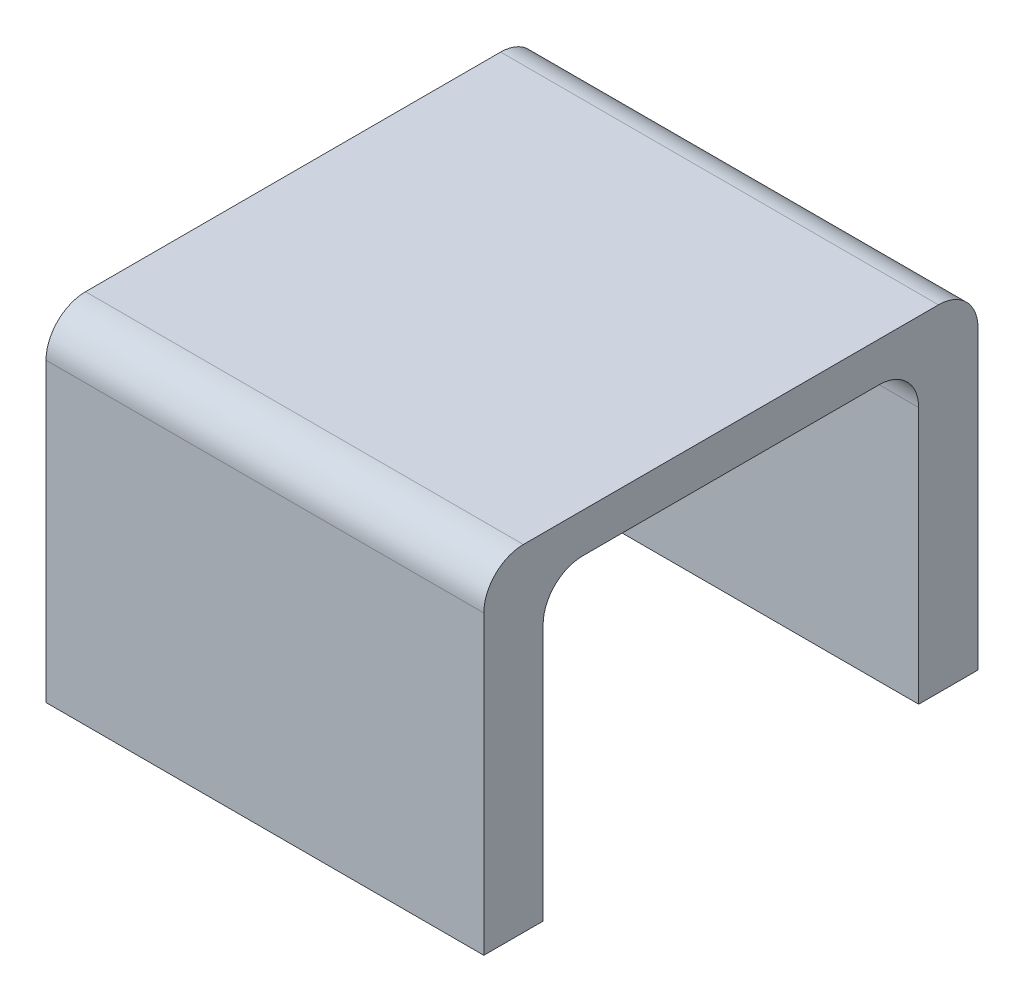
ISO-10303-21;
HEADER;
FILE_DESCRIPTION(('STEP AP214'),'2;1');
FILE_NAME('part.step','',(''),(''),'','','');
FILE_SCHEMA(('AUTOMOTIVE_DESIGN { 1 0 10303 214 1 1 1 1 }'));
ENDSEC;
DATA;
#1=APPLICATION_CONTEXT('core data for automotive mechanical design processes');
#2=APPLICATION_PROTOCOL_DEFINITION('international standard','automotive_design',2000,#1);
#3=PRODUCT_CONTEXT('',#1,'mechanical');
#4=PRODUCT('Part','Part','',(#3));
#5=PRODUCT_RELATED_PRODUCT_CATEGORY('part','',(#4));
#6=PRODUCT_DEFINITION_FORMATION('','',#4);
#7=PRODUCT_DEFINITION_CONTEXT('part definition',#1,'design');
#8=PRODUCT_DEFINITION('design','',#6,#7);
#9=PRODUCT_DEFINITION_SHAPE('','',#8);
#10=(LENGTH_UNIT() NAMED_UNIT(*) SI_UNIT(.MILLI.,.METRE.));
#11=(NAMED_UNIT(*) PLANE_ANGLE_UNIT() SI_UNIT($,.RADIAN.));
#12=(NAMED_UNIT(*) SI_UNIT($,.STERADIAN.) SOLID_ANGLE_UNIT());
#13=UNCERTAINTY_MEASURE_WITH_UNIT(LENGTH_MEASURE(1.E-05),#10,'distance_accuracy_value','');
#14=(GEOMETRIC_REPRESENTATION_CONTEXT(3) GLOBAL_UNCERTAINTY_ASSIGNED_CONTEXT((#13)) GLOBAL_UNIT_ASSIGNED_CONTEXT((#10,
#11,#12)) REPRESENTATION_CONTEXT('',''));
#15=CARTESIAN_POINT('',(0.,0.,0.));
#16=DIRECTION('',(0.,0.,1.));
#17=DIRECTION('',(1.,0.,0.));
#18=AXIS2_PLACEMENT_3D('',#15,#16,#17);
#19=CARTESIAN_POINT('',(0.,0.,0.));
#20=DIRECTION('',(0.,1.,0.));
#21=DIRECTION('',(0.,0.,1.));
#22=AXIS2_PLACEMENT_3D('',#19,#20,#21);
#23=PLANE('',#22);
#24=DIRECTION('',(0.,0.,1.));
#25=VECTOR('',#24,1.);
#26=CARTESIAN_POINT('',(6.16632653061225,0.,-12.8401360544218));
#27=LINE('',#26,#25);
#28=CARTESIAN_POINT('',(6.16632653061225,0.,9.15986394557823));
#29=VERTEX_POINT('',#28);
#30=CARTESIAN_POINT('',(6.16632653061225,0.,12.1598639455782));
#31=VERTEX_POINT('',#30);
#32=EDGE_CURVE('E214',#29,#31,#27,.T.);
#33=ORIENTED_EDGE('',*,*,#32,.F.);
#34=DIRECTION('',(-1.,0.,0.));
#35=VECTOR('',#34,1.);
#36=CARTESIAN_POINT('',(6.16632653061225,0.,9.15986394557823));
#37=LINE('',#36,#35);
#38=CARTESIAN_POINT('',(28.3163265306122,0.,9.15986394557823));
#39=VERTEX_POINT('',#38);
#40=EDGE_CURVE('E147',#39,#29,#37,.T.);
#41=ORIENTED_EDGE('',*,*,#40,.F.);
#42=DIRECTION('',(0.,0.,-1.));
#43=VECTOR('',#42,1.);
#44=CARTESIAN_POINT('',(28.3163265306122,0.,-12.8401360544218));
#45=LINE('',#44,#43);
#46=CARTESIAN_POINT('',(28.3163265306122,0.,12.1598639455782));
#47=VERTEX_POINT('',#46);
#48=EDGE_CURVE('E152',#47,#39,#45,.T.);
#49=ORIENTED_EDGE('',*,*,#48,.F.);
#50=DIRECTION('',(1.,0.,0.));
#51=VECTOR('',#50,1.);
#52=CARTESIAN_POINT('',(6.16632653061225,0.,12.1598639455782));
#53=LINE('',#52,#51);
#54=EDGE_CURVE('E153',#31,#47,#53,.T.);
#55=ORIENTED_EDGE('',*,*,#54,.F.);
#56=EDGE_LOOP('',(#33,#41,#49,#55));
#57=FACE_BOUND('',#56,.T.);
#58=ADVANCED_FACE('F39',(#57),#23,.F.);
#59=CARTESIAN_POINT('',(6.16632653061225,17.,-12.8401360544218));
#60=DIRECTION('',(1.,0.,0.));
#61=DIRECTION('',(0.,0.,-1.));
#62=AXIS2_PLACEMENT_3D('',#59,#60,#61);
#63=PLANE('',#62);
#64=DIRECTION('',(0.,0.,1.));
#65=VECTOR('',#64,1.);
#66=CARTESIAN_POINT('',(6.16632653061225,17.,-12.8401360544218));
#67=LINE('',#66,#65);
#68=CARTESIAN_POINT('',(6.16632653061225,17.,-10.8401360544218));
#69=VERTEX_POINT('',#68);
#70=CARTESIAN_POINT('',(6.16632653061225,17.,10.1598639455782));
#71=VERTEX_POINT('',#70);
#72=EDGE_CURVE('E162',#69,#71,#67,.T.);
#73=ORIENTED_EDGE('',*,*,#72,.F.);
#74=CARTESIAN_POINT('',(6.16632653061225,15.,-10.8401360544218));
#75=DIRECTION('',(1.,0.,0.));
#76=DIRECTION('',(0.,0.,-1.));
#77=AXIS2_PLACEMENT_3D('',#74,#75,#76);
#78=CIRCLE('',#77,2.);
#79=CARTESIAN_POINT('',(6.16632653061225,15.,-12.8401360544218));
#80=VERTEX_POINT('',#79);
#81=EDGE_CURVE('E197',#69,#80,#78,.F.);
#82=ORIENTED_EDGE('',*,*,#81,.T.);
#83=DIRECTION('',(0.,-1.,0.));
#84=VECTOR('',#83,1.);
#85=CARTESIAN_POINT('',(6.16632653061225,17.,-12.8401360544218));
#86=LINE('',#85,#84);
#87=CARTESIAN_POINT('',(6.16632653061225,0.,-12.8401360544218));
#88=VERTEX_POINT('',#87);
#89=EDGE_CURVE('E163',#80,#88,#86,.T.);
#90=ORIENTED_EDGE('',*,*,#89,.T.);
#91=CARTESIAN_POINT('',(6.16632653061225,0.,-9.84013605442176));
#92=VERTEX_POINT('',#91);
#93=EDGE_CURVE('E157',#88,#92,#27,.T.);
#94=ORIENTED_EDGE('',*,*,#93,.T.);
#95=DIRECTION('',(0.,-1.,0.));
#96=VECTOR('',#95,1.);
#97=CARTESIAN_POINT('',(6.16632653061225,15.,-9.84013605442176));
#98=LINE('',#97,#96);
#99=CARTESIAN_POINT('',(6.16632653061225,13.,-9.84013605442176));
#100=VERTEX_POINT('',#99);
#101=EDGE_CURVE('E138',#100,#92,#98,.T.);
#102=ORIENTED_EDGE('',*,*,#101,.F.);
#103=CARTESIAN_POINT('',(6.16632653061225,13.,-7.84013605442176));
#104=DIRECTION('',(1.,0.,0.));
#105=DIRECTION('',(0.,0.,-1.));
#106=AXIS2_PLACEMENT_3D('',#103,#104,#105);
#107=CIRCLE('',#106,2.);
#108=CARTESIAN_POINT('',(6.16632653061225,15.,-7.84013605442176));
#109=VERTEX_POINT('',#108);
#110=EDGE_CURVE('E183',#100,#109,#107,.T.);
#111=ORIENTED_EDGE('',*,*,#110,.T.);
#112=DIRECTION('',(0.,0.,-1.));
#113=VECTOR('',#112,1.);
#114=CARTESIAN_POINT('',(6.16632653061225,15.,9.15986394557823));
#115=LINE('',#114,#113);
#116=CARTESIAN_POINT('',(6.16632653061225,15.,7.15986394557823));
#117=VERTEX_POINT('',#116);
#118=EDGE_CURVE('E224',#117,#109,#115,.T.);
#119=ORIENTED_EDGE('',*,*,#118,.F.);
#120=CARTESIAN_POINT('',(6.16632653061225,13.,7.15986394557823));
#121=DIRECTION('',(1.,0.,0.));
#122=DIRECTION('',(0.,0.,-1.));
#123=AXIS2_PLACEMENT_3D('',#120,#121,#122);
#124=CIRCLE('',#123,2.);
#125=CARTESIAN_POINT('',(6.16632653061225,13.,9.15986394557823));
#126=VERTEX_POINT('',#125);
#127=EDGE_CURVE('E185',#117,#126,#124,.T.);
#128=ORIENTED_EDGE('',*,*,#127,.T.);
#129=DIRECTION('',(0.,-1.,0.));
#130=VECTOR('',#129,1.);
#131=CARTESIAN_POINT('',(6.16632653061225,15.,9.15986394557823));
#132=LINE('',#131,#130);
#133=EDGE_CURVE('E216',#126,#29,#132,.T.);
#134=ORIENTED_EDGE('',*,*,#133,.T.);
#135=ORIENTED_EDGE('',*,*,#32,.T.);
#136=DIRECTION('',(0.,-1.,0.));
#137=VECTOR('',#136,1.);
#138=CARTESIAN_POINT('',(6.16632653061225,17.,12.1598639455782));
#139=LINE('',#138,#137);
#140=CARTESIAN_POINT('',(6.16632653061225,15.,12.1598639455782));
#141=VERTEX_POINT('',#140);
#142=EDGE_CURVE('E170',#141,#31,#139,.T.);
#143=ORIENTED_EDGE('',*,*,#142,.F.);
#144=CARTESIAN_POINT('',(6.16632653061225,15.,10.1598639455782));
#145=DIRECTION('',(1.,0.,0.));
#146=DIRECTION('',(0.,0.,-1.));
#147=AXIS2_PLACEMENT_3D('',#144,#145,#146);
#148=CIRCLE('',#147,2.);
#149=EDGE_CURVE('E195',#141,#71,#148,.F.);
#150=ORIENTED_EDGE('',*,*,#149,.T.);
#151=EDGE_LOOP('',(#73,#82,#90,#94,#102,#111,#119,#128,#134,#135,#143,#150));
#152=FACE_BOUND('',#151,.T.);
#153=ADVANCED_FACE('F212',(#152),#63,.F.);
#154=CARTESIAN_POINT('',(6.16632653061225,17.,12.1598639455782));
#155=DIRECTION('',(0.,0.,-1.));
#156=DIRECTION('',(-1.,0.,0.));
#157=AXIS2_PLACEMENT_3D('',#154,#155,#156);
#158=PLANE('',#157);
#159=DIRECTION('',(0.,-1.,0.));
#160=VECTOR('',#159,1.);
#161=CARTESIAN_POINT('',(28.3163265306122,17.,12.1598639455782));
#162=LINE('',#161,#160);
#163=CARTESIAN_POINT('',(28.3163265306122,15.,12.1598639455782));
#164=VERTEX_POINT('',#163);
#165=EDGE_CURVE('E168',#164,#47,#162,.T.);
#166=ORIENTED_EDGE('',*,*,#165,.F.);
#167=DIRECTION('',(1.,0.,0.));
#168=VECTOR('',#167,1.);
#169=CARTESIAN_POINT('',(6.16632653061225,15.,12.1598639455782));
#170=LINE('',#169,#168);
#171=EDGE_CURVE('E11',#164,#141,#170,.F.);
#172=ORIENTED_EDGE('',*,*,#171,.T.);
#173=ORIENTED_EDGE('',*,*,#142,.T.);
#174=ORIENTED_EDGE('',*,*,#54,.T.);
#175=EDGE_LOOP('',(#166,#172,#173,#174));
#176=FACE_BOUND('',#175,.T.);
#177=ADVANCED_FACE('F255',(#176),#158,.F.);
#178=CARTESIAN_POINT('',(28.3163265306122,17.,-12.8401360544218));
#179=DIRECTION('',(-1.,0.,0.));
#180=DIRECTION('',(0.,0.,1.));
#181=AXIS2_PLACEMENT_3D('',#178,#179,#180);
#182=PLANE('',#181);
#183=DIRECTION('',(0.,-1.,0.));
#184=VECTOR('',#183,1.);
#185=CARTESIAN_POINT('',(28.3163265306122,17.,-12.8401360544218));
#186=LINE('',#185,#184);
#187=CARTESIAN_POINT('',(28.3163265306122,15.,-12.8401360544218));
#188=VERTEX_POINT('',#187);
#189=CARTESIAN_POINT('',(28.3163265306122,0.,-12.8401360544218));
#190=VERTEX_POINT('',#189);
#191=EDGE_CURVE('E165',#188,#190,#186,.T.);
#192=ORIENTED_EDGE('',*,*,#191,.F.);
#193=CARTESIAN_POINT('',(28.3163265306122,15.,-10.8401360544218));
#194=DIRECTION('',(-1.,0.,0.));
#195=DIRECTION('',(0.,0.,1.));
#196=AXIS2_PLACEMENT_3D('',#193,#194,#195);
#197=CIRCLE('',#196,2.);
#198=CARTESIAN_POINT('',(28.3163265306122,17.,-10.8401360544218));
#199=VERTEX_POINT('',#198);
#200=EDGE_CURVE('E47',#188,#199,#197,.F.);
#201=ORIENTED_EDGE('',*,*,#200,.T.);
#202=DIRECTION('',(0.,0.,-1.));
#203=VECTOR('',#202,1.);
#204=CARTESIAN_POINT('',(28.3163265306122,17.,-12.8401360544218));
#205=LINE('',#204,#203);
#206=CARTESIAN_POINT('',(28.3163265306122,17.,10.1598639455782));
#207=VERTEX_POINT('',#206);
#208=EDGE_CURVE('E166',#207,#199,#205,.T.);
#209=ORIENTED_EDGE('',*,*,#208,.F.);
#210=CARTESIAN_POINT('',(28.3163265306122,15.,10.1598639455782));
#211=DIRECTION('',(-1.,0.,0.));
#212=DIRECTION('',(0.,0.,1.));
#213=AXIS2_PLACEMENT_3D('',#210,#211,#212);
#214=CIRCLE('',#213,2.);
#215=EDGE_CURVE('E54',#207,#164,#214,.F.);
#216=ORIENTED_EDGE('',*,*,#215,.T.);
#217=ORIENTED_EDGE('',*,*,#165,.T.);
#218=ORIENTED_EDGE('',*,*,#48,.T.);
#219=DIRECTION('',(0.,-1.,0.));
#220=VECTOR('',#219,1.);
#221=CARTESIAN_POINT('',(28.3163265306122,15.,9.15986394557823));
#222=LINE('',#221,#220);
#223=CARTESIAN_POINT('',(28.3163265306122,13.,9.15986394557823));
#224=VERTEX_POINT('',#223);
#225=EDGE_CURVE('E137',#224,#39,#222,.T.);
#226=ORIENTED_EDGE('',*,*,#225,.F.);
#227=CARTESIAN_POINT('',(28.3163265306122,13.,7.15986394557823));
#228=DIRECTION('',(-1.,0.,0.));
#229=DIRECTION('',(0.,0.,1.));
#230=AXIS2_PLACEMENT_3D('',#227,#228,#229);
#231=CIRCLE('',#230,2.);
#232=CARTESIAN_POINT('',(28.3163265306122,15.,7.15986394557823));
#233=VERTEX_POINT('',#232);
#234=EDGE_CURVE('E187',#224,#233,#231,.T.);
#235=ORIENTED_EDGE('',*,*,#234,.T.);
#236=DIRECTION('',(0.,0.,1.));
#237=VECTOR('',#236,1.);
#238=CARTESIAN_POINT('',(28.3163265306122,15.,9.15986394557823));
#239=LINE('',#238,#237);
#240=CARTESIAN_POINT('',(28.3163265306122,15.,-7.84013605442177));
#241=VERTEX_POINT('',#240);
#242=EDGE_CURVE('E219',#241,#233,#239,.T.);
#243=ORIENTED_EDGE('',*,*,#242,.F.);
#244=CARTESIAN_POINT('',(28.3163265306122,13.,-7.84013605442177));
#245=DIRECTION('',(-1.,0.,0.));
#246=DIRECTION('',(0.,0.,1.));
#247=AXIS2_PLACEMENT_3D('',#244,#245,#246);
#248=CIRCLE('',#247,2.);
#249=CARTESIAN_POINT('',(28.3163265306122,13.,-9.84013605442176));
#250=VERTEX_POINT('',#249);
#251=EDGE_CURVE('E134',#241,#250,#248,.T.);
#252=ORIENTED_EDGE('',*,*,#251,.T.);
#253=DIRECTION('',(0.,-1.,0.));
#254=VECTOR('',#253,1.);
#255=CARTESIAN_POINT('',(28.3163265306122,15.,-9.84013605442176));
#256=LINE('',#255,#254);
#257=CARTESIAN_POINT('',(28.3163265306122,0.,-9.84013605442176));
#258=VERTEX_POINT('',#257);
#259=EDGE_CURVE('E127',#250,#258,#256,.T.);
#260=ORIENTED_EDGE('',*,*,#259,.T.);
#261=EDGE_CURVE('E131',#258,#190,#45,.T.);
#262=ORIENTED_EDGE('',*,*,#261,.T.);
#263=EDGE_LOOP('',(#192,#201,#209,#216,#217,#218,#226,#235,#243,#252,#260,#262));
#264=FACE_BOUND('',#263,.T.);
#265=ADVANCED_FACE('F129',(#264),#182,.F.);
#266=CARTESIAN_POINT('',(6.16632653061225,17.,-12.8401360544218));
#267=DIRECTION('',(0.,0.,1.));
#268=DIRECTION('',(1.,0.,0.));
#269=AXIS2_PLACEMENT_3D('',#266,#267,#268);
#270=PLANE('',#269);
#271=ORIENTED_EDGE('',*,*,#89,.F.);
#272=DIRECTION('',(-1.,0.,0.));
#273=VECTOR('',#272,1.);
#274=CARTESIAN_POINT('',(28.3163265306122,15.,-12.8401360544218));
#275=LINE('',#274,#273);
#276=EDGE_CURVE('E62',#80,#188,#275,.F.);
#277=ORIENTED_EDGE('',*,*,#276,.T.);
#278=ORIENTED_EDGE('',*,*,#191,.T.);
#279=DIRECTION('',(-1.,0.,0.));
#280=VECTOR('',#279,1.);
#281=CARTESIAN_POINT('',(6.16632653061225,0.,-12.8401360544218));
#282=LINE('',#281,#280);
#283=EDGE_CURVE('E151',#190,#88,#282,.T.);
#284=ORIENTED_EDGE('',*,*,#283,.T.);
#285=EDGE_LOOP('',(#271,#277,#278,#284));
#286=FACE_BOUND('',#285,.T.);
#287=ADVANCED_FACE('F213',(#286),#270,.F.);
#288=CARTESIAN_POINT('',(0.,17.,0.));
#289=DIRECTION('',(0.,1.,0.));
#290=DIRECTION('',(0.,0.,1.));
#291=AXIS2_PLACEMENT_3D('',#288,#289,#290);
#292=PLANE('',#291);
#293=ORIENTED_EDGE('',*,*,#208,.T.);
#294=DIRECTION('',(-1.,0.,0.));
#295=VECTOR('',#294,1.);
#296=CARTESIAN_POINT('',(6.16632653061225,17.,-10.8401360544218));
#297=LINE('',#296,#295);
#298=EDGE_CURVE('E192',#199,#69,#297,.T.);
#299=ORIENTED_EDGE('',*,*,#298,.T.);
#300=ORIENTED_EDGE('',*,*,#72,.T.);
#301=DIRECTION('',(1.,0.,0.));
#302=VECTOR('',#301,1.);
#303=CARTESIAN_POINT('',(28.3163265306122,17.,10.1598639455782));
#304=LINE('',#303,#302);
#305=EDGE_CURVE('E189',#71,#207,#304,.T.);
#306=ORIENTED_EDGE('',*,*,#305,.T.);
#307=EDGE_LOOP('',(#293,#299,#300,#306));
#308=FACE_BOUND('',#307,.T.);
#309=ADVANCED_FACE('F205',(#308),#292,.T.);
#310=ORIENTED_EDGE('',*,*,#261,.F.);
#311=DIRECTION('',(1.,0.,0.));
#312=VECTOR('',#311,1.);
#313=CARTESIAN_POINT('',(6.16632653061225,0.,-9.84013605442176));
#314=LINE('',#313,#312);
#315=EDGE_CURVE('E141',#92,#258,#314,.T.);
#316=ORIENTED_EDGE('',*,*,#315,.F.);
#317=ORIENTED_EDGE('',*,*,#93,.F.);
#318=ORIENTED_EDGE('',*,*,#283,.F.);
#319=EDGE_LOOP('',(#310,#316,#317,#318));
#320=FACE_BOUND('',#319,.T.);
#321=ADVANCED_FACE('F149',(#320),#23,.F.);
#322=CARTESIAN_POINT('',(6.16632653061225,15.,9.15986394557823));
#323=DIRECTION('',(0.,0.,1.));
#324=DIRECTION('',(1.,0.,0.));
#325=AXIS2_PLACEMENT_3D('',#322,#323,#324);
#326=PLANE('',#325);
#327=ORIENTED_EDGE('',*,*,#133,.F.);
#328=DIRECTION('',(-1.,0.,0.));
#329=VECTOR('',#328,1.);
#330=CARTESIAN_POINT('',(6.16632653061225,13.,9.15986394557823));
#331=LINE('',#330,#329);
#332=EDGE_CURVE('E180',#126,#224,#331,.F.);
#333=ORIENTED_EDGE('',*,*,#332,.T.);
#334=ORIENTED_EDGE('',*,*,#225,.T.);
#335=ORIENTED_EDGE('',*,*,#40,.T.);
#336=EDGE_LOOP('',(#327,#333,#334,#335));
#337=FACE_BOUND('',#336,.T.);
#338=ADVANCED_FACE('F259',(#337),#326,.F.);
#339=CARTESIAN_POINT('',(6.16632653061225,15.,-9.84013605442176));
#340=DIRECTION('',(0.,0.,-1.));
#341=DIRECTION('',(-1.,0.,0.));
#342=AXIS2_PLACEMENT_3D('',#339,#340,#341);
#343=PLANE('',#342);
#344=ORIENTED_EDGE('',*,*,#259,.F.);
#345=DIRECTION('',(1.,0.,0.));
#346=VECTOR('',#345,1.);
#347=CARTESIAN_POINT('',(6.16632653061225,13.,-9.84013605442176));
#348=LINE('',#347,#346);
#349=EDGE_CURVE('E178',#250,#100,#348,.F.);
#350=ORIENTED_EDGE('',*,*,#349,.T.);
#351=ORIENTED_EDGE('',*,*,#101,.T.);
#352=ORIENTED_EDGE('',*,*,#315,.T.);
#353=EDGE_LOOP('',(#344,#350,#351,#352));
#354=FACE_BOUND('',#353,.T.);
#355=ADVANCED_FACE('F142',(#354),#343,.F.);
#356=CARTESIAN_POINT('',(0.,15.,0.));
#357=DIRECTION('',(0.,-1.,0.));
#358=DIRECTION('',(0.,0.,-1.));
#359=AXIS2_PLACEMENT_3D('',#356,#357,#358);
#360=PLANE('',#359);
#361=ORIENTED_EDGE('',*,*,#118,.T.);
#362=DIRECTION('',(1.,0.,0.));
#363=VECTOR('',#362,1.);
#364=CARTESIAN_POINT('',(0.,15.,-7.84013605442176));
#365=LINE('',#364,#363);
#366=EDGE_CURVE('E175',#109,#241,#365,.T.);
#367=ORIENTED_EDGE('',*,*,#366,.T.);
#368=ORIENTED_EDGE('',*,*,#242,.T.);
#369=DIRECTION('',(-1.,0.,0.));
#370=VECTOR('',#369,1.);
#371=CARTESIAN_POINT('',(0.,15.,7.15986394557823));
#372=LINE('',#371,#370);
#373=EDGE_CURVE('E172',#233,#117,#372,.T.);
#374=ORIENTED_EDGE('',*,*,#373,.T.);
#375=EDGE_LOOP('',(#361,#367,#368,#374));
#376=FACE_BOUND('',#375,.T.);
#377=ADVANCED_FACE('F232',(#376),#360,.T.);
#378=CARTESIAN_POINT('',(0.,13.,-7.84013605442176));
#379=DIRECTION('',(1.,0.,0.));
#380=DIRECTION('',(0.,0.,-1.));
#381=AXIS2_PLACEMENT_3D('',#378,#379,#380);
#382=CYLINDRICAL_SURFACE('',#381,2.);
#383=ORIENTED_EDGE('',*,*,#110,.F.);
#384=ORIENTED_EDGE('',*,*,#349,.F.);
#385=ORIENTED_EDGE('',*,*,#251,.F.);
#386=ORIENTED_EDGE('',*,*,#366,.F.);
#387=EDGE_LOOP('',(#383,#384,#385,#386));
#388=FACE_BOUND('',#387,.T.);
#389=ADVANCED_FACE('F236',(#388),#382,.F.);
#390=CARTESIAN_POINT('',(0.,13.,7.15986394557823));
#391=DIRECTION('',(-1.,0.,0.));
#392=DIRECTION('',(0.,0.,1.));
#393=AXIS2_PLACEMENT_3D('',#390,#391,#392);
#394=CYLINDRICAL_SURFACE('',#393,2.);
#395=ORIENTED_EDGE('',*,*,#234,.F.);
#396=ORIENTED_EDGE('',*,*,#332,.F.);
#397=ORIENTED_EDGE('',*,*,#127,.F.);
#398=ORIENTED_EDGE('',*,*,#373,.F.);
#399=EDGE_LOOP('',(#395,#396,#397,#398));
#400=FACE_BOUND('',#399,.T.);
#401=ADVANCED_FACE('F238',(#400),#394,.F.);
#402=CARTESIAN_POINT('',(0.,15.,-10.8401360544218));
#403=DIRECTION('',(1.,0.,0.));
#404=DIRECTION('',(0.,0.,-1.));
#405=AXIS2_PLACEMENT_3D('',#402,#403,#404);
#406=CYLINDRICAL_SURFACE('',#405,2.);
#407=ORIENTED_EDGE('',*,*,#200,.F.);
#408=ORIENTED_EDGE('',*,*,#276,.F.);
#409=ORIENTED_EDGE('',*,*,#81,.F.);
#410=ORIENTED_EDGE('',*,*,#298,.F.);
#411=EDGE_LOOP('',(#407,#408,#409,#410));
#412=FACE_BOUND('',#411,.T.);
#413=ADVANCED_FACE('F210',(#412),#406,.T.);
#414=CARTESIAN_POINT('',(0.,15.,10.1598639455782));
#415=DIRECTION('',(-1.,0.,0.));
#416=DIRECTION('',(0.,0.,1.));
#417=AXIS2_PLACEMENT_3D('',#414,#415,#416);
#418=CYLINDRICAL_SURFACE('',#417,2.);
#419=ORIENTED_EDGE('',*,*,#149,.F.);
#420=ORIENTED_EDGE('',*,*,#171,.F.);
#421=ORIENTED_EDGE('',*,*,#215,.F.);
#422=ORIENTED_EDGE('',*,*,#305,.F.);
#423=EDGE_LOOP('',(#419,#420,#421,#422));
#424=FACE_BOUND('',#423,.T.);
#425=ADVANCED_FACE('F41',(#424),#418,.T.);
#426=CLOSED_SHELL('',(#58,#153,#177,#265,#287,#309,#321,#338,#355,#377,#389,#401,#413,#425));
#427=MANIFOLD_SOLID_BREP('B2',#426);
#428=ADVANCED_BREP_SHAPE_REPRESENTATION('',(#18,#427),#14);
#429=SHAPE_DEFINITION_REPRESENTATION(#9,#428);
ENDSEC;
END-ISO-10303-21;
